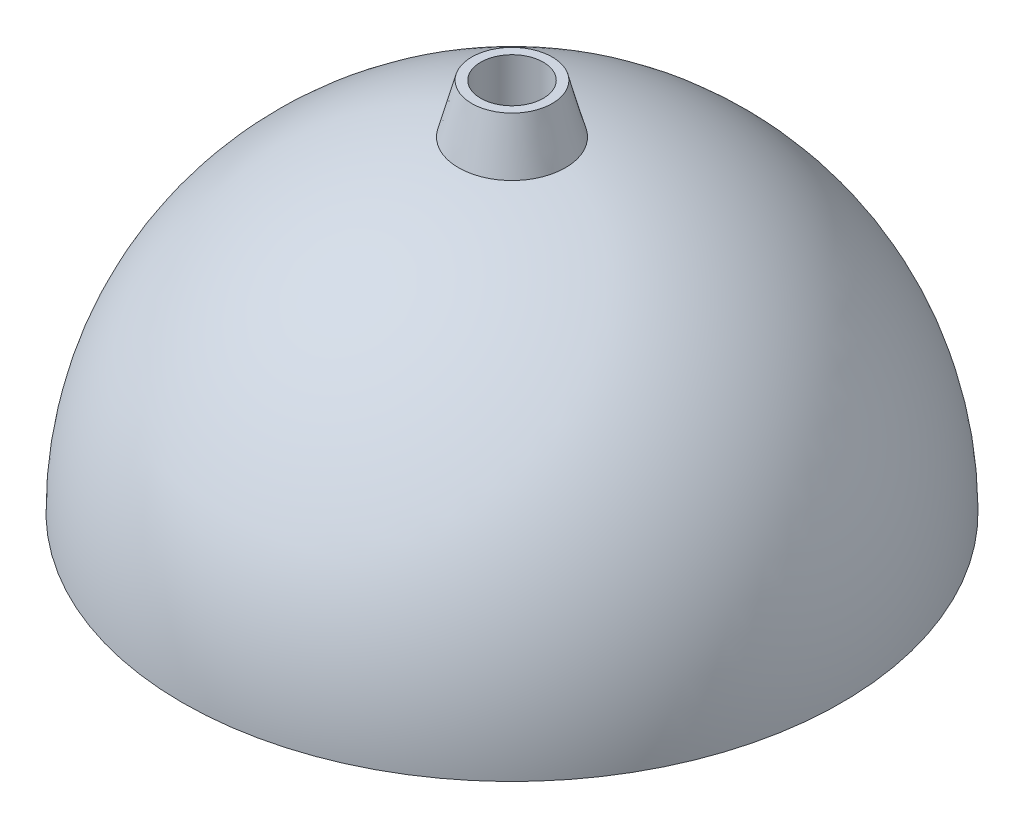
ISO-10303-21;
HEADER;
FILE_DESCRIPTION(('STEP AP214'),'2;1');
FILE_NAME('part.step','',(''),(''),'','','');
FILE_SCHEMA(('AUTOMOTIVE_DESIGN { 1 0 10303 214 1 1 1 1 }'));
ENDSEC;
DATA;
#1=APPLICATION_CONTEXT('core data for automotive mechanical design processes');
#2=APPLICATION_PROTOCOL_DEFINITION('international standard','automotive_design',2000,#1);
#3=PRODUCT_CONTEXT('',#1,'mechanical');
#4=PRODUCT('Part','Part','',(#3));
#5=PRODUCT_RELATED_PRODUCT_CATEGORY('part','',(#4));
#6=PRODUCT_DEFINITION_FORMATION('','',#4);
#7=PRODUCT_DEFINITION_CONTEXT('part definition',#1,'design');
#8=PRODUCT_DEFINITION('design','',#6,#7);
#9=PRODUCT_DEFINITION_SHAPE('','',#8);
#10=(LENGTH_UNIT() NAMED_UNIT(*) SI_UNIT(.MILLI.,.METRE.));
#11=(NAMED_UNIT(*) PLANE_ANGLE_UNIT() SI_UNIT($,.RADIAN.));
#12=(NAMED_UNIT(*) SI_UNIT($,.STERADIAN.) SOLID_ANGLE_UNIT());
#13=UNCERTAINTY_MEASURE_WITH_UNIT(LENGTH_MEASURE(1.E-05),#10,'distance_accuracy_value','');
#14=(GEOMETRIC_REPRESENTATION_CONTEXT(3) GLOBAL_UNCERTAINTY_ASSIGNED_CONTEXT((#13)) GLOBAL_UNIT_ASSIGNED_CONTEXT((#10,
#11,#12)) REPRESENTATION_CONTEXT('',''));
#15=CARTESIAN_POINT('',(0.,0.,0.));
#16=DIRECTION('',(0.,0.,1.));
#17=DIRECTION('',(1.,0.,0.));
#18=AXIS2_PLACEMENT_3D('',#15,#16,#17);
#19=CARTESIAN_POINT('',(0.,0.,0.));
#20=DIRECTION('',(0.,1.,0.));
#21=DIRECTION('',(1.,0.,0.));
#22=AXIS2_PLACEMENT_3D('',#19,#20,#21);
#23=SPHERICAL_SURFACE('',#22,73.66);
#24=CARTESIAN_POINT('',(0.,72.6857558818395,0.));
#25=DIRECTION('',(0.,-1.,0.));
#26=DIRECTION('',(0.,0.,-1.));
#27=AXIS2_PLACEMENT_3D('',#24,#25,#26);
#28=CIRCLE('',#27,11.9405398490031);
#29=CARTESIAN_POINT('',(0.,72.6857558818395,-11.9405398490031));
#30=VERTEX_POINT('',#29);
#31=EDGE_CURVE('E38',#30,#30,#28,.F.);
#32=ORIENTED_EDGE('',*,*,#31,.F.);
#33=EDGE_LOOP('',(#32));
#34=FACE_BOUND('',#33,.T.);
#35=CARTESIAN_POINT('',(0.,0.,0.));
#36=DIRECTION('',(0.,1.,0.));
#37=DIRECTION('',(0.,0.,1.));
#38=AXIS2_PLACEMENT_3D('',#35,#36,#37);
#39=CIRCLE('',#38,73.66);
#40=CARTESIAN_POINT('',(0.,0.,73.66));
#41=VERTEX_POINT('',#40);
#42=EDGE_CURVE('E47',#41,#41,#39,.T.);
#43=ORIENTED_EDGE('',*,*,#42,.T.);
#44=EDGE_LOOP('',(#43));
#45=FACE_BOUND('',#44,.T.);
#46=ADVANCED_FACE('F34',(#34,#45),#23,.T.);
#47=CARTESIAN_POINT('',(0.,0.,0.));
#48=DIRECTION('',(0.,-1.,0.));
#49=DIRECTION('',(-1.,0.,0.));
#50=AXIS2_PLACEMENT_3D('',#47,#48,#49);
#51=SPHERICAL_SURFACE('',#50,70.66);
#52=CARTESIAN_POINT('',(0.,40.636282208791,0.));
#53=DIRECTION('',(0.,-1.,0.));
#54=DIRECTION('',(0.,0.,-1.));
#55=AXIS2_PLACEMENT_3D('',#52,#53,#54);
#56=CIRCLE('',#55,57.805952705993);
#57=CARTESIAN_POINT('',(-57.805952705993,40.636282208791,0.));
#58=VERTEX_POINT('',#57);
#59=EDGE_CURVE('E42',#58,#58,#56,.T.);
#60=CARTESIAN_POINT('',(0.,70.3124142666144,0.));
#61=DIRECTION('',(0.,-1.,0.));
#62=DIRECTION('',(0.,0.,-1.));
#63=AXIS2_PLACEMENT_3D('',#60,#61,#62);
#64=CIRCLE('',#63,7.);
#65=CARTESIAN_POINT('',(-6.99999999999991,70.3124142666144,0.));
#66=VERTEX_POINT('',#65);
#67=EDGE_CURVE('E50',#66,#66,#64,.F.);
#68=CARTESIAN_POINT('',(-57.805952705993,40.636282208791,0.));
#69=CARTESIAN_POINT('',(-57.4424095260213,41.1534337228464,0.));
#70=CARTESIAN_POINT('',(-57.0719229976022,41.6657040947187,0.));
#71=CARTESIAN_POINT('',(-56.3173378326195,42.6801193251516,0.));
#72=CARTESIAN_POINT('',(-55.9332391960559,43.1822641837123,0.));
#73=CARTESIAN_POINT('',(-55.1517044035344,44.1760651585767,0.));
#74=CARTESIAN_POINT('',(-54.7542682475765,44.6677212748805,0.));
#75=CARTESIAN_POINT('',(-53.9463452389753,45.6401910453989,0.));
#76=CARTESIAN_POINT('',(-53.5358583863321,46.1210046996136,0.));
#77=CARTESIAN_POINT('',(-52.7021295033591,47.0714431121582,0.));
#78=CARTESIAN_POINT('',(-52.2788874730292,47.5410678704882,0.));
#79=CARTESIAN_POINT('',(-51.4199531296718,48.4687902569749,0.));
#80=CARTESIAN_POINT('',(-50.9842608166443,48.9268878851316,0.));
#81=CARTESIAN_POINT('',(-50.1007397200991,49.8312260422139,0.));
#82=CARTESIAN_POINT('',(-49.6529109365814,50.2774665711394,0.));
#83=CARTESIAN_POINT('',(-48.7454394665303,51.1577691112724,0.));
#84=CARTESIAN_POINT('',(-48.2857967799968,51.5918311224798,0.));
#85=CARTESIAN_POINT('',(-47.3550285771437,52.4474639780011,0.));
#86=CARTESIAN_POINT('',(-46.8839030608241,52.8690348223149,0.));
#87=CARTESIAN_POINT('',(-45.9305085435173,53.6993816928041,0.));
#88=CARTESIAN_POINT('',(-45.4482395425302,54.1081577189794,0.));
#89=CARTESIAN_POINT('',(-44.4729054272377,54.9126205176759,0.));
#90=CARTESIAN_POINT('',(-43.9798403129324,55.308307290197,0.));
#91=CARTESIAN_POINT('',(-42.9832691187074,56.0863065741216,0.));
#92=CARTESIAN_POINT('',(-42.4797630387877,56.4686190855252,0.));
#93=CARTESIAN_POINT('',(-41.4626725814959,57.2195944730251,0.));
#94=CARTESIAN_POINT('',(-40.9490882041239,57.5882573491213,0.));
#95=CARTESIAN_POINT('',(-39.9122110793468,58.3116679234559,0.));
#96=CARTESIAN_POINT('',(-39.3889183319417,58.6664156216941,0.));
#97=CARTESIAN_POINT('',(-38.3330013873154,59.3617403206629,0.));
#98=CARTESIAN_POINT('',(-37.8003771900942,59.7023173213933,0.));
#99=CARTESIAN_POINT('',(-36.7261809873615,60.3690553126459,0.));
#100=CARTESIAN_POINT('',(-36.18460898185,60.695216303168,0.));
#101=CARTESIAN_POINT('',(-35.0929072490398,61.3328873449475,0.));
#102=CARTESIAN_POINT('',(-34.5427775217411,61.6443973962049,0.));
#103=CARTESIAN_POINT('',(-33.4343565958631,62.2525421832587,0.));
#104=CARTESIAN_POINT('',(-32.8760653972838,62.5491769190551,0.));
#105=CARTESIAN_POINT('',(-31.7517236579413,63.1273574134659,0.));
#106=CARTESIAN_POINT('',(-31.1856731171781,63.4089031720802,0.));
#107=CARTESIAN_POINT('',(-30.0462204115065,63.9567029187787,0.));
#108=CARTESIAN_POINT('',(-29.4728182465983,64.2229569068628,0.));
#109=CARTESIAN_POINT('',(-28.3190753059443,64.7399813335929,0.));
#110=CARTESIAN_POINT('',(-27.7387345301986,64.9907517722387,0.));
#111=CARTESIAN_POINT('',(-26.5715323789592,65.4766284737677,0.));
#112=CARTESIAN_POINT('',(-25.9846710034656,65.7117347366508,0.));
#113=CARTESIAN_POINT('',(-24.8048503605112,66.1661137429863,0.));
#114=CARTESIAN_POINT('',(-24.2118910930504,66.3853864864388,0.));
#115=CARTESIAN_POINT('',(-23.0203017661767,66.8079405149871,0.));
#116=CARTESIAN_POINT('',(-22.4216717067638,67.011221800083,0.));
#117=CARTESIAN_POINT('',(-21.21917198055,67.401646491087,0.));
#118=CARTESIAN_POINT('',(-20.6153023137491,67.5887898969952,0.));
#119=CARTESIAN_POINT('',(-19.4027583314892,67.9468040338761,0.));
#120=CARTESIAN_POINT('',(-18.7940840160302,68.1176747648489,0.));
#121=CARTESIAN_POINT('',(-17.5723691553346,68.4430204725982,0.));
#122=CARTESIAN_POINT('',(-16.959328610098,68.5974954493747,0.));
#123=CARTESIAN_POINT('',(-15.7293228557821,68.8899383958397,0.));
#124=CARTESIAN_POINT('',(-15.1123576467028,69.0279063655282,0.));
#125=CARTESIAN_POINT('',(-13.8749469495953,69.2872358721944,0.));
#126=CARTESIAN_POINT('',(-13.254501461567,69.4085974091722,0.));
#127=CARTESIAN_POINT('',(-12.0105771278078,69.6346268193845,0.));
#128=CARTESIAN_POINT('',(-11.3870982820768,69.7392946926191,0.));
#129=CARTESIAN_POINT('',(-10.1375562287309,69.9318606981428,0.));
#130=CARTESIAN_POINT('',(-9.51149302111604,70.0197588304319,0.));
#131=CARTESIAN_POINT('',(-8.25723351298664,70.1787246041484,0.));
#132=CARTESIAN_POINT('',(-7.62903721247212,70.2497922455758,0.));
#133=CARTESIAN_POINT('',(-6.99999999999991,70.3124142666144,0.));
#134=B_SPLINE_CURVE_WITH_KNOTS('',3,(#68,#69,#70,#71,#72,#73,#74,#75,#76,#77,#78,#79,#80,#81,
#82,#83,#84,#85,#86,#87,#88,#89,#90,#91,#92,#93,#94,#95,#96,#97,#98,#99,#100,#101,#102,#103,
#104,#105,#106,#107,#108,#109,#110,#111,#112,#113,#114,#115,#116,#117,#118,#119,#120,#121,#122,
#123,#124,#125,#126,#127,#128,#129,#130,#131,#132,#133),.UNSPECIFIED.,.F.,.F.,(4,2,2,2,2,2,2,2,
2,2,2,2,2,2,2,2,2,2,2,2,2,2,2,2,2,2,2,2,2,2,2,2,4),(0.,1.89638272983019,3.79276545966037,
5.68914818949055,7.58553091932074,9.48191364915093,11.3782963789811,13.2746791088113,
15.1710618386415,17.0674445684717,18.9638272983018,20.860210028132,22.7565927579622,
24.6529754877924,26.5493582176226,28.4457409474528,30.3421236772829,32.2385064071131,
34.1348891369433,36.0312718667735,37.9276545966037,39.8240373264339,41.720420056264,
43.6168027860942,45.5131855159244,47.4095682457546,49.3059509755848,51.202333705415,
53.0987164352452,54.9950991650753,56.8914818949055,58.7878646247357,60.6842473545659),.UNSPECIFIED.);
#135=EDGE_CURVE('BSEAM79',#58,#66,#134,.T.);
#136=ORIENTED_EDGE('',*,*,#59,.T.);
#137=ORIENTED_EDGE('',*,*,#67,.T.);
#138=ORIENTED_EDGE('',*,*,#135,.T.);
#139=ORIENTED_EDGE('',*,*,#135,.F.);
#140=EDGE_LOOP('',(#136,#138,#137,#139));
#141=FACE_BOUND('',#140,.T.);
#142=ADVANCED_FACE('F79',(#141),#51,.F.);
#143=CARTESIAN_POINT('',(0.,0.,0.));
#144=DIRECTION('',(0.,1.,0.));
#145=DIRECTION('',(0.,0.,1.));
#146=AXIS2_PLACEMENT_3D('',#143,#144,#145);
#147=PLANE('',#146);
#148=CARTESIAN_POINT('',(39.6755045297412,0.,54.6086471203095));
#149=DIRECTION('',(0.,-1.,0.));
#150=DIRECTION('',(-0.587785252292462,0.,-0.809016994374955));
#151=AXIS2_PLACEMENT_3D('',#148,#149,#150);
#152=CIRCLE('',#151,1.75);
#153=CARTESIAN_POINT('',(38.6468803382294,0.,53.1928673801533));
#154=VERTEX_POINT('',#153);
#155=EDGE_CURVE('E200',#154,#154,#152,.T.);
#156=ORIENTED_EDGE('',*,*,#155,.F.);
#157=EDGE_LOOP('',(#156));
#158=FACE_BOUND('',#157,.T.);
#159=CARTESIAN_POINT('',(64.1963148499226,0.,20.8586471203097));
#160=DIRECTION('',(0.,-1.,0.));
#161=DIRECTION('',(-0.95105651629515,0.,-0.309016994374958));
#162=AXIS2_PLACEMENT_3D('',#159,#160,#161);
#163=CIRCLE('',#162,1.75);
#164=CARTESIAN_POINT('',(62.5319659464061,0.,20.3178673801535));
#165=VERTEX_POINT('',#164);
#166=EDGE_CURVE('E208',#165,#165,#163,.T.);
#167=ORIENTED_EDGE('',*,*,#166,.F.);
#168=EDGE_LOOP('',(#167));
#169=FACE_BOUND('',#168,.T.);
#170=CARTESIAN_POINT('',(64.1963148499231,0.,-20.8586471203083));
#171=DIRECTION('',(0.,-1.,0.));
#172=DIRECTION('',(-0.951056516295157,0.,0.309016994374938));
#173=AXIS2_PLACEMENT_3D('',#170,#171,#172);
#174=CIRCLE('',#173,1.75);
#175=CARTESIAN_POINT('',(62.5319659464065,0.,-20.3178673801522));
#176=VERTEX_POINT('',#175);
#177=EDGE_CURVE('E213',#176,#176,#174,.T.);
#178=ORIENTED_EDGE('',*,*,#177,.F.);
#179=EDGE_LOOP('',(#178));
#180=FACE_BOUND('',#179,.T.);
#181=CARTESIAN_POINT('',(39.6755045297424,0.,-54.6086471203086));
#182=DIRECTION('',(0.,-1.,0.));
#183=DIRECTION('',(-0.58778525229248,0.,0.809016994374942));
#184=AXIS2_PLACEMENT_3D('',#181,#182,#183);
#185=CIRCLE('',#184,1.75);
#186=CARTESIAN_POINT('',(38.6468803382306,0.,-53.1928673801525));
#187=VERTEX_POINT('',#186);
#188=EDGE_CURVE('E219',#187,#187,#185,.T.);
#189=ORIENTED_EDGE('',*,*,#188,.F.);
#190=EDGE_LOOP('',(#189));
#191=FACE_BOUND('',#190,.T.);
#192=CARTESIAN_POINT('',(0.,0.,-67.5));
#193=DIRECTION('',(0.,-1.,0.));
#194=DIRECTION('',(0.,0.,1.));
#195=AXIS2_PLACEMENT_3D('',#192,#193,#194);
#196=CIRCLE('',#195,1.75);
#197=CARTESIAN_POINT('',(0.,0.,-65.75));
#198=VERTEX_POINT('',#197);
#199=EDGE_CURVE('E225',#198,#198,#196,.T.);
#200=ORIENTED_EDGE('',*,*,#199,.F.);
#201=EDGE_LOOP('',(#200));
#202=FACE_BOUND('',#201,.T.);
#203=CARTESIAN_POINT('',(-39.6755045297416,0.,-54.6086471203092));
#204=DIRECTION('',(0.,-1.,0.));
#205=DIRECTION('',(0.587785252292469,0.,0.809016994374951));
#206=AXIS2_PLACEMENT_3D('',#203,#204,#205);
#207=CIRCLE('',#206,1.75);
#208=CARTESIAN_POINT('',(-38.6468803382298,0.,-53.192867380153));
#209=VERTEX_POINT('',#208);
#210=EDGE_CURVE('E231',#209,#209,#207,.T.);
#211=ORIENTED_EDGE('',*,*,#210,.F.);
#212=EDGE_LOOP('',(#211));
#213=FACE_BOUND('',#212,.T.);
#214=CARTESIAN_POINT('',(-64.1963148499228,0.,-20.8586471203092));
#215=DIRECTION('',(0.,-1.,0.));
#216=DIRECTION('',(0.951056516295152,0.,0.309016994374952));
#217=AXIS2_PLACEMENT_3D('',#214,#215,#216);
#218=CIRCLE('',#217,1.75);
#219=CARTESIAN_POINT('',(-62.5319659464063,0.,-20.3178673801531));
#220=VERTEX_POINT('',#219);
#221=EDGE_CURVE('E237',#220,#220,#218,.T.);
#222=ORIENTED_EDGE('',*,*,#221,.F.);
#223=EDGE_LOOP('',(#222));
#224=FACE_BOUND('',#223,.T.);
#225=CARTESIAN_POINT('',(-64.1963148499229,0.,20.8586471203088));
#226=DIRECTION('',(0.,-1.,0.));
#227=DIRECTION('',(0.951056516295155,0.,-0.309016994374945));
#228=AXIS2_PLACEMENT_3D('',#225,#226,#227);
#229=CIRCLE('',#228,1.75);
#230=CARTESIAN_POINT('',(-62.5319659464064,0.,20.3178673801526));
#231=VERTEX_POINT('',#230);
#232=EDGE_CURVE('E243',#231,#231,#229,.T.);
#233=ORIENTED_EDGE('',*,*,#232,.F.);
#234=EDGE_LOOP('',(#233));
#235=FACE_BOUND('',#234,.T.);
#236=CARTESIAN_POINT('',(-39.675504529742,0.,54.6086471203089));
#237=DIRECTION('',(0.,-1.,0.));
#238=DIRECTION('',(0.587785252292474,0.,-0.809016994374947));
#239=AXIS2_PLACEMENT_3D('',#236,#237,#238);
#240=CIRCLE('',#239,1.75);
#241=CARTESIAN_POINT('',(-38.6468803382302,0.,53.1928673801528));
#242=VERTEX_POINT('',#241);
#243=EDGE_CURVE('E68',#242,#242,#240,.T.);
#244=ORIENTED_EDGE('',*,*,#243,.F.);
#245=EDGE_LOOP('',(#244));
#246=FACE_BOUND('',#245,.T.);
#247=CARTESIAN_POINT('',(0.,0.,67.5));
#248=DIRECTION('',(0.,-1.,0.));
#249=DIRECTION('',(0.,0.,-1.));
#250=AXIS2_PLACEMENT_3D('',#247,#248,#249);
#251=CIRCLE('',#250,1.75);
#252=CARTESIAN_POINT('',(0.,0.,65.75));
#253=VERTEX_POINT('',#252);
#254=EDGE_CURVE('E60',#253,#253,#251,.T.);
#255=ORIENTED_EDGE('',*,*,#254,.F.);
#256=EDGE_LOOP('',(#255));
#257=FACE_BOUND('',#256,.T.);
#258=CARTESIAN_POINT('',(0.,0.,0.));
#259=DIRECTION('',(0.,-1.,0.));
#260=DIRECTION('',(0.,0.,-1.));
#261=AXIS2_PLACEMENT_3D('',#258,#259,#260);
#262=CIRCLE('',#261,50.8);
#263=CARTESIAN_POINT('',(0.,0.,-50.8));
#264=VERTEX_POINT('',#263);
#265=EDGE_CURVE('E57',#264,#264,#262,.T.);
#266=ORIENTED_EDGE('',*,*,#265,.F.);
#267=EDGE_LOOP('',(#266));
#268=FACE_BOUND('',#267,.T.);
#269=ORIENTED_EDGE('',*,*,#42,.F.);
#270=EDGE_LOOP('',(#269));
#271=FACE_BOUND('',#270,.T.);
#272=ADVANCED_FACE('F76',(#158,#169,#180,#191,#202,#213,#224,#235,#246,#257,#268,#271),#147,.F.);
#273=CARTESIAN_POINT('',(0.,35.,0.));
#274=DIRECTION('',(0.,-1.,0.));
#275=DIRECTION('',(0.,0.,-1.));
#276=AXIS2_PLACEMENT_3D('',#273,#274,#275);
#277=CYLINDRICAL_SURFACE('',#276,50.8);
#278=CARTESIAN_POINT('',(0.,5.,0.));
#279=DIRECTION('',(0.,-1.,0.));
#280=DIRECTION('',(0.,0.,-1.));
#281=AXIS2_PLACEMENT_3D('',#278,#279,#280);
#282=CIRCLE('',#281,50.8);
#283=CARTESIAN_POINT('',(0.,5.,-50.8));
#284=VERTEX_POINT('',#283);
#285=EDGE_CURVE('E52',#284,#284,#282,.T.);
#286=ORIENTED_EDGE('',*,*,#285,.F.);
#287=EDGE_LOOP('',(#286));
#288=FACE_BOUND('',#287,.T.);
#289=ORIENTED_EDGE('',*,*,#265,.T.);
#290=EDGE_LOOP('',(#289));
#291=FACE_BOUND('',#290,.T.);
#292=ADVANCED_FACE('F78',(#288,#291),#277,.F.);
#293=CARTESIAN_POINT('',(0.,5.,0.));
#294=DIRECTION('',(0.,1.,0.));
#295=DIRECTION('',(0.,0.,1.));
#296=AXIS2_PLACEMENT_3D('',#293,#294,#295);
#297=CONICAL_SURFACE('',#296,50.8,0.383972435438754);
#298=CARTESIAN_POINT('',(0.,26.3907435519357,0.));
#299=DIRECTION('',(0.,-1.,0.));
#300=DIRECTION('',(0.,0.,-1.));
#301=AXIS2_PLACEMENT_3D('',#298,#299,#300);
#302=CIRCLE('',#301,59.4424213850963);
#303=CARTESIAN_POINT('',(0.,26.3907435519357,-59.4424213850963));
#304=VERTEX_POINT('',#303);
#305=EDGE_CURVE('E10',#304,#304,#302,.F.);
#306=ORIENTED_EDGE('',*,*,#305,.T.);
#307=EDGE_LOOP('',(#306));
#308=FACE_BOUND('',#307,.T.);
#309=ORIENTED_EDGE('',*,*,#285,.T.);
#310=EDGE_LOOP('',(#309));
#311=FACE_BOUND('',#310,.T.);
#312=ADVANCED_FACE('F86',(#308,#311),#297,.F.);
#313=CARTESIAN_POINT('',(0.,32.0098424531744,0.));
#314=DIRECTION('',(0.,-1.,0.));
#315=DIRECTION('',(0.,0.,-1.));
#316=AXIS2_PLACEMENT_3D('',#313,#314,#315);
#317=TOROIDAL_SURFACE('',#316,45.5346635665945,15.);
#318=ORIENTED_EDGE('',*,*,#305,.F.);
#319=EDGE_LOOP('',(#318));
#320=FACE_BOUND('',#319,.T.);
#321=ORIENTED_EDGE('',*,*,#59,.F.);
#322=EDGE_LOOP('',(#321));
#323=FACE_BOUND('',#322,.T.);
#324=ADVANCED_FACE('F102',(#320,#323),#317,.F.);
#325=CARTESIAN_POINT('',(0.,73.66,0.));
#326=DIRECTION('',(0.,-1.,0.));
#327=DIRECTION('',(0.,0.,-1.));
#328=AXIS2_PLACEMENT_3D('',#325,#326,#327);
#329=CYLINDRICAL_SURFACE('',#328,7.);
#330=ORIENTED_EDGE('',*,*,#67,.F.);
#331=EDGE_LOOP('',(#330));
#332=FACE_BOUND('',#331,.T.);
#333=CARTESIAN_POINT('',(0.,83.66,0.));
#334=DIRECTION('',(0.,1.,0.));
#335=DIRECTION('',(0.,0.,1.));
#336=AXIS2_PLACEMENT_3D('',#333,#334,#335);
#337=CIRCLE('',#336,7.);
#338=CARTESIAN_POINT('',(0.,83.66,7.));
#339=VERTEX_POINT('',#338);
#340=EDGE_CURVE('E196',#339,#339,#337,.T.);
#341=ORIENTED_EDGE('',*,*,#340,.T.);
#342=EDGE_LOOP('',(#341));
#343=FACE_BOUND('',#342,.T.);
#344=ADVANCED_FACE('F103',(#332,#343),#329,.F.);
#345=CARTESIAN_POINT('',(0.,10.,67.5));
#346=DIRECTION('',(0.,-1.,0.));
#347=DIRECTION('',(0.,0.,-1.));
#348=AXIS2_PLACEMENT_3D('',#345,#346,#347);
#349=CYLINDRICAL_SURFACE('',#348,1.75);
#350=CARTESIAN_POINT('',(0.,10.,67.5));
#351=DIRECTION('',(0.,-1.,0.));
#352=DIRECTION('',(0.,0.,-1.));
#353=AXIS2_PLACEMENT_3D('',#350,#351,#352);
#354=CIRCLE('',#353,1.75);
#355=CARTESIAN_POINT('',(0.,10.,65.75));
#356=VERTEX_POINT('',#355);
#357=EDGE_CURVE('E53',#356,#356,#354,.T.);
#358=ORIENTED_EDGE('',*,*,#357,.F.);
#359=EDGE_LOOP('',(#358));
#360=FACE_BOUND('',#359,.T.);
#361=ORIENTED_EDGE('',*,*,#254,.T.);
#362=EDGE_LOOP('',(#361));
#363=FACE_BOUND('',#362,.T.);
#364=ADVANCED_FACE('F106',(#360,#363),#349,.F.);
#365=CARTESIAN_POINT('',(0.,10.,67.5));
#366=DIRECTION('',(0.,-1.,0.));
#367=DIRECTION('',(0.,0.,-1.));
#368=AXIS2_PLACEMENT_3D('',#365,#366,#367);
#369=PLANE('',#368);
#370=ORIENTED_EDGE('',*,*,#357,.T.);
#371=EDGE_LOOP('',(#370));
#372=FACE_BOUND('',#371,.T.);
#373=ADVANCED_FACE('F110',(#372),#369,.T.);
#374=CARTESIAN_POINT('',(-39.675504529742,10.,54.6086471203089));
#375=DIRECTION('',(0.,-1.,0.));
#376=DIRECTION('',(0.,0.,-1.));
#377=AXIS2_PLACEMENT_3D('',#374,#375,#376);
#378=CYLINDRICAL_SURFACE('',#377,1.75);
#379=CARTESIAN_POINT('',(-39.675504529742,10.,54.6086471203089));
#380=DIRECTION('',(0.,-1.,0.));
#381=DIRECTION('',(0.587785252292474,0.,-0.809016994374947));
#382=AXIS2_PLACEMENT_3D('',#379,#380,#381);
#383=CIRCLE('',#382,1.75);
#384=CARTESIAN_POINT('',(-38.6468803382302,10.,53.1928673801528));
#385=VERTEX_POINT('',#384);
#386=EDGE_CURVE('E65',#385,#385,#383,.T.);
#387=ORIENTED_EDGE('',*,*,#386,.F.);
#388=EDGE_LOOP('',(#387));
#389=FACE_BOUND('',#388,.T.);
#390=ORIENTED_EDGE('',*,*,#243,.T.);
#391=EDGE_LOOP('',(#390));
#392=FACE_BOUND('',#391,.T.);
#393=ADVANCED_FACE('F114',(#389,#392),#378,.F.);
#394=CARTESIAN_POINT('',(-39.675504529742,10.,54.6086471203089));
#395=DIRECTION('',(0.,-1.,0.));
#396=DIRECTION('',(0.587785252292474,0.,-0.809016994374947));
#397=AXIS2_PLACEMENT_3D('',#394,#395,#396);
#398=PLANE('',#397);
#399=ORIENTED_EDGE('',*,*,#386,.T.);
#400=EDGE_LOOP('',(#399));
#401=FACE_BOUND('',#400,.T.);
#402=ADVANCED_FACE('F117',(#401),#398,.T.);
#403=CARTESIAN_POINT('',(-64.1963148499229,10.,20.8586471203088));
#404=DIRECTION('',(0.,-1.,0.));
#405=DIRECTION('',(0.,0.,-1.));
#406=AXIS2_PLACEMENT_3D('',#403,#404,#405);
#407=CYLINDRICAL_SURFACE('',#406,1.75);
#408=CARTESIAN_POINT('',(-64.1963148499229,10.,20.8586471203088));
#409=DIRECTION('',(0.,-1.,0.));
#410=DIRECTION('',(0.951056516295155,0.,-0.309016994374945));
#411=AXIS2_PLACEMENT_3D('',#408,#409,#410);
#412=CIRCLE('',#411,1.75);
#413=CARTESIAN_POINT('',(-62.5319659464064,10.,20.3178673801526));
#414=VERTEX_POINT('',#413);
#415=EDGE_CURVE('E246',#414,#414,#412,.T.);
#416=ORIENTED_EDGE('',*,*,#415,.F.);
#417=EDGE_LOOP('',(#416));
#418=FACE_BOUND('',#417,.T.);
#419=ORIENTED_EDGE('',*,*,#232,.T.);
#420=EDGE_LOOP('',(#419));
#421=FACE_BOUND('',#420,.T.);
#422=ADVANCED_FACE('F121',(#418,#421),#407,.F.);
#423=CARTESIAN_POINT('',(-64.1963148499229,10.,20.8586471203088));
#424=DIRECTION('',(0.,-1.,0.));
#425=DIRECTION('',(0.951056516295155,0.,-0.309016994374945));
#426=AXIS2_PLACEMENT_3D('',#423,#424,#425);
#427=PLANE('',#426);
#428=ORIENTED_EDGE('',*,*,#415,.T.);
#429=EDGE_LOOP('',(#428));
#430=FACE_BOUND('',#429,.T.);
#431=ADVANCED_FACE('F125',(#430),#427,.T.);
#432=CARTESIAN_POINT('',(-64.1963148499228,10.,-20.8586471203092));
#433=DIRECTION('',(0.,-1.,0.));
#434=DIRECTION('',(0.,0.,-1.));
#435=AXIS2_PLACEMENT_3D('',#432,#433,#434);
#436=CYLINDRICAL_SURFACE('',#435,1.75);
#437=CARTESIAN_POINT('',(-64.1963148499228,10.,-20.8586471203092));
#438=DIRECTION('',(0.,-1.,0.));
#439=DIRECTION('',(0.951056516295152,0.,0.309016994374952));
#440=AXIS2_PLACEMENT_3D('',#437,#438,#439);
#441=CIRCLE('',#440,1.75);
#442=CARTESIAN_POINT('',(-62.5319659464063,10.,-20.3178673801531));
#443=VERTEX_POINT('',#442);
#444=EDGE_CURVE('E240',#443,#443,#441,.T.);
#445=ORIENTED_EDGE('',*,*,#444,.F.);
#446=EDGE_LOOP('',(#445));
#447=FACE_BOUND('',#446,.T.);
#448=ORIENTED_EDGE('',*,*,#221,.T.);
#449=EDGE_LOOP('',(#448));
#450=FACE_BOUND('',#449,.T.);
#451=ADVANCED_FACE('F129',(#447,#450),#436,.F.);
#452=CARTESIAN_POINT('',(-64.1963148499228,10.,-20.8586471203092));
#453=DIRECTION('',(0.,-1.,0.));
#454=DIRECTION('',(0.951056516295152,0.,0.309016994374952));
#455=AXIS2_PLACEMENT_3D('',#452,#453,#454);
#456=PLANE('',#455);
#457=ORIENTED_EDGE('',*,*,#444,.T.);
#458=EDGE_LOOP('',(#457));
#459=FACE_BOUND('',#458,.T.);
#460=ADVANCED_FACE('F133',(#459),#456,.T.);
#461=CARTESIAN_POINT('',(-39.6755045297416,10.,-54.6086471203092));
#462=DIRECTION('',(0.,-1.,0.));
#463=DIRECTION('',(0.,0.,-1.));
#464=AXIS2_PLACEMENT_3D('',#461,#462,#463);
#465=CYLINDRICAL_SURFACE('',#464,1.75);
#466=CARTESIAN_POINT('',(-39.6755045297416,10.,-54.6086471203092));
#467=DIRECTION('',(0.,-1.,0.));
#468=DIRECTION('',(0.587785252292469,0.,0.809016994374951));
#469=AXIS2_PLACEMENT_3D('',#466,#467,#468);
#470=CIRCLE('',#469,1.75);
#471=CARTESIAN_POINT('',(-38.6468803382298,10.,-53.192867380153));
#472=VERTEX_POINT('',#471);
#473=EDGE_CURVE('E234',#472,#472,#470,.T.);
#474=ORIENTED_EDGE('',*,*,#473,.F.);
#475=EDGE_LOOP('',(#474));
#476=FACE_BOUND('',#475,.T.);
#477=ORIENTED_EDGE('',*,*,#210,.T.);
#478=EDGE_LOOP('',(#477));
#479=FACE_BOUND('',#478,.T.);
#480=ADVANCED_FACE('F137',(#476,#479),#465,.F.);
#481=CARTESIAN_POINT('',(-39.6755045297416,10.,-54.6086471203092));
#482=DIRECTION('',(0.,-1.,0.));
#483=DIRECTION('',(0.587785252292469,0.,0.809016994374951));
#484=AXIS2_PLACEMENT_3D('',#481,#482,#483);
#485=PLANE('',#484);
#486=ORIENTED_EDGE('',*,*,#473,.T.);
#487=EDGE_LOOP('',(#486));
#488=FACE_BOUND('',#487,.T.);
#489=ADVANCED_FACE('F141',(#488),#485,.T.);
#490=CARTESIAN_POINT('',(0.,10.,-67.5));
#491=DIRECTION('',(0.,-1.,0.));
#492=DIRECTION('',(0.,0.,-1.));
#493=AXIS2_PLACEMENT_3D('',#490,#491,#492);
#494=CYLINDRICAL_SURFACE('',#493,1.75);
#495=CARTESIAN_POINT('',(0.,10.,-67.5));
#496=DIRECTION('',(0.,-1.,0.));
#497=DIRECTION('',(0.,0.,1.));
#498=AXIS2_PLACEMENT_3D('',#495,#496,#497);
#499=CIRCLE('',#498,1.75);
#500=CARTESIAN_POINT('',(0.,10.,-65.75));
#501=VERTEX_POINT('',#500);
#502=EDGE_CURVE('E228',#501,#501,#499,.T.);
#503=ORIENTED_EDGE('',*,*,#502,.F.);
#504=EDGE_LOOP('',(#503));
#505=FACE_BOUND('',#504,.T.);
#506=ORIENTED_EDGE('',*,*,#199,.T.);
#507=EDGE_LOOP('',(#506));
#508=FACE_BOUND('',#507,.T.);
#509=ADVANCED_FACE('F145',(#505,#508),#494,.F.);
#510=CARTESIAN_POINT('',(0.,10.,-67.5));
#511=DIRECTION('',(0.,-1.,0.));
#512=DIRECTION('',(0.,0.,1.));
#513=AXIS2_PLACEMENT_3D('',#510,#511,#512);
#514=PLANE('',#513);
#515=ORIENTED_EDGE('',*,*,#502,.T.);
#516=EDGE_LOOP('',(#515));
#517=FACE_BOUND('',#516,.T.);
#518=ADVANCED_FACE('F149',(#517),#514,.T.);
#519=CARTESIAN_POINT('',(39.6755045297424,10.,-54.6086471203086));
#520=DIRECTION('',(0.,-1.,0.));
#521=DIRECTION('',(0.,0.,-1.));
#522=AXIS2_PLACEMENT_3D('',#519,#520,#521);
#523=CYLINDRICAL_SURFACE('',#522,1.75);
#524=CARTESIAN_POINT('',(39.6755045297424,10.,-54.6086471203086));
#525=DIRECTION('',(0.,-1.,0.));
#526=DIRECTION('',(-0.58778525229248,0.,0.809016994374942));
#527=AXIS2_PLACEMENT_3D('',#524,#525,#526);
#528=CIRCLE('',#527,1.75);
#529=CARTESIAN_POINT('',(38.6468803382306,10.,-53.1928673801525));
#530=VERTEX_POINT('',#529);
#531=EDGE_CURVE('E222',#530,#530,#528,.T.);
#532=ORIENTED_EDGE('',*,*,#531,.F.);
#533=EDGE_LOOP('',(#532));
#534=FACE_BOUND('',#533,.T.);
#535=ORIENTED_EDGE('',*,*,#188,.T.);
#536=EDGE_LOOP('',(#535));
#537=FACE_BOUND('',#536,.T.);
#538=ADVANCED_FACE('F153',(#534,#537),#523,.F.);
#539=CARTESIAN_POINT('',(39.6755045297424,10.,-54.6086471203086));
#540=DIRECTION('',(0.,-1.,0.));
#541=DIRECTION('',(-0.58778525229248,0.,0.809016994374942));
#542=AXIS2_PLACEMENT_3D('',#539,#540,#541);
#543=PLANE('',#542);
#544=ORIENTED_EDGE('',*,*,#531,.T.);
#545=EDGE_LOOP('',(#544));
#546=FACE_BOUND('',#545,.T.);
#547=ADVANCED_FACE('F157',(#546),#543,.T.);
#548=CARTESIAN_POINT('',(64.1963148499231,10.,-20.8586471203083));
#549=DIRECTION('',(0.,-1.,0.));
#550=DIRECTION('',(0.,0.,-1.));
#551=AXIS2_PLACEMENT_3D('',#548,#549,#550);
#552=CYLINDRICAL_SURFACE('',#551,1.75);
#553=CARTESIAN_POINT('',(64.1963148499231,10.,-20.8586471203083));
#554=DIRECTION('',(0.,-1.,0.));
#555=DIRECTION('',(-0.951056516295157,0.,0.309016994374938));
#556=AXIS2_PLACEMENT_3D('',#553,#554,#555);
#557=CIRCLE('',#556,1.75);
#558=CARTESIAN_POINT('',(62.5319659464065,10.,-20.3178673801522));
#559=VERTEX_POINT('',#558);
#560=EDGE_CURVE('E216',#559,#559,#557,.T.);
#561=ORIENTED_EDGE('',*,*,#560,.F.);
#562=EDGE_LOOP('',(#561));
#563=FACE_BOUND('',#562,.T.);
#564=ORIENTED_EDGE('',*,*,#177,.T.);
#565=EDGE_LOOP('',(#564));
#566=FACE_BOUND('',#565,.T.);
#567=ADVANCED_FACE('F161',(#563,#566),#552,.F.);
#568=CARTESIAN_POINT('',(64.1963148499231,10.,-20.8586471203083));
#569=DIRECTION('',(0.,-1.,0.));
#570=DIRECTION('',(-0.951056516295157,0.,0.309016994374938));
#571=AXIS2_PLACEMENT_3D('',#568,#569,#570);
#572=PLANE('',#571);
#573=ORIENTED_EDGE('',*,*,#560,.T.);
#574=EDGE_LOOP('',(#573));
#575=FACE_BOUND('',#574,.T.);
#576=ADVANCED_FACE('F165',(#575),#572,.T.);
#577=CARTESIAN_POINT('',(64.1963148499226,10.,20.8586471203097));
#578=DIRECTION('',(0.,-1.,0.));
#579=DIRECTION('',(0.,0.,-1.));
#580=AXIS2_PLACEMENT_3D('',#577,#578,#579);
#581=CYLINDRICAL_SURFACE('',#580,1.75);
#582=CARTESIAN_POINT('',(64.1963148499226,10.,20.8586471203097));
#583=DIRECTION('',(0.,-1.,0.));
#584=DIRECTION('',(-0.95105651629515,0.,-0.309016994374958));
#585=AXIS2_PLACEMENT_3D('',#582,#583,#584);
#586=CIRCLE('',#585,1.75);
#587=CARTESIAN_POINT('',(62.5319659464061,10.,20.3178673801535));
#588=VERTEX_POINT('',#587);
#589=EDGE_CURVE('E210',#588,#588,#586,.T.);
#590=ORIENTED_EDGE('',*,*,#589,.F.);
#591=EDGE_LOOP('',(#590));
#592=FACE_BOUND('',#591,.T.);
#593=ORIENTED_EDGE('',*,*,#166,.T.);
#594=EDGE_LOOP('',(#593));
#595=FACE_BOUND('',#594,.T.);
#596=ADVANCED_FACE('F169',(#592,#595),#581,.F.);
#597=CARTESIAN_POINT('',(64.1963148499226,10.,20.8586471203097));
#598=DIRECTION('',(0.,-1.,0.));
#599=DIRECTION('',(-0.95105651629515,0.,-0.309016994374958));
#600=AXIS2_PLACEMENT_3D('',#597,#598,#599);
#601=PLANE('',#600);
#602=ORIENTED_EDGE('',*,*,#589,.T.);
#603=EDGE_LOOP('',(#602));
#604=FACE_BOUND('',#603,.T.);
#605=ADVANCED_FACE('F173',(#604),#601,.T.);
#606=CARTESIAN_POINT('',(39.6755045297412,10.,54.6086471203095));
#607=DIRECTION('',(0.,-1.,0.));
#608=DIRECTION('',(0.,0.,-1.));
#609=AXIS2_PLACEMENT_3D('',#606,#607,#608);
#610=CYLINDRICAL_SURFACE('',#609,1.75);
#611=CARTESIAN_POINT('',(39.6755045297412,10.,54.6086471203095));
#612=DIRECTION('',(0.,-1.,0.));
#613=DIRECTION('',(-0.587785252292462,0.,-0.809016994374955));
#614=AXIS2_PLACEMENT_3D('',#611,#612,#613);
#615=CIRCLE('',#614,1.75);
#616=CARTESIAN_POINT('',(38.6468803382294,10.,53.1928673801533));
#617=VERTEX_POINT('',#616);
#618=EDGE_CURVE('E203',#617,#617,#615,.T.);
#619=ORIENTED_EDGE('',*,*,#618,.F.);
#620=EDGE_LOOP('',(#619));
#621=FACE_BOUND('',#620,.T.);
#622=ORIENTED_EDGE('',*,*,#155,.T.);
#623=EDGE_LOOP('',(#622));
#624=FACE_BOUND('',#623,.T.);
#625=ADVANCED_FACE('F177',(#621,#624),#610,.F.);
#626=CARTESIAN_POINT('',(39.6755045297412,10.,54.6086471203095));
#627=DIRECTION('',(0.,-1.,0.));
#628=DIRECTION('',(-0.587785252292462,0.,-0.809016994374955));
#629=AXIS2_PLACEMENT_3D('',#626,#627,#628);
#630=PLANE('',#629);
#631=ORIENTED_EDGE('',*,*,#618,.T.);
#632=EDGE_LOOP('',(#631));
#633=FACE_BOUND('',#632,.T.);
#634=ADVANCED_FACE('F181',(#633),#630,.T.);
#635=CARTESIAN_POINT('',(0.,83.66,0.));
#636=DIRECTION('',(0.,-1.,0.));
#637=DIRECTION('',(0.,0.,1.));
#638=AXIS2_PLACEMENT_3D('',#635,#636,#637);
#639=CONICAL_SURFACE('',#638,9.,0.26179938779915);
#640=CARTESIAN_POINT('',(0.,83.66,0.));
#641=DIRECTION('',(0.,1.,0.));
#642=DIRECTION('',(0.,0.,1.));
#643=AXIS2_PLACEMENT_3D('',#640,#641,#642);
#644=CIRCLE('',#643,9.);
#645=CARTESIAN_POINT('',(0.,83.66,9.));
#646=VERTEX_POINT('',#645);
#647=EDGE_CURVE('E199',#646,#646,#644,.T.);
#648=ORIENTED_EDGE('',*,*,#647,.F.);
#649=EDGE_LOOP('',(#648));
#650=FACE_BOUND('',#649,.T.);
#651=ORIENTED_EDGE('',*,*,#31,.T.);
#652=EDGE_LOOP('',(#651));
#653=FACE_BOUND('',#652,.T.);
#654=ADVANCED_FACE('F36',(#650,#653),#639,.T.);
#655=CARTESIAN_POINT('',(0.,83.66,0.));
#656=DIRECTION('',(0.,1.,0.));
#657=DIRECTION('',(0.,0.,1.));
#658=AXIS2_PLACEMENT_3D('',#655,#656,#657);
#659=PLANE('',#658);
#660=ORIENTED_EDGE('',*,*,#340,.F.);
#661=EDGE_LOOP('',(#660));
#662=FACE_BOUND('',#661,.T.);
#663=ORIENTED_EDGE('',*,*,#647,.T.);
#664=EDGE_LOOP('',(#663));
#665=FACE_BOUND('',#664,.T.);
#666=ADVANCED_FACE('F186',(#662,#665),#659,.T.);
#667=CLOSED_SHELL('',(#46,#142,#272,#292,#312,#324,#344,#364,#373,#393,#402,#422,#431,#451,#460,
#480,#489,#509,#518,#538,#547,#567,#576,#596,#605,#625,#634,#654,#666));
#668=MANIFOLD_SOLID_BREP('B2',#667);
#669=ADVANCED_BREP_SHAPE_REPRESENTATION('',(#18,#668),#14);
#670=SHAPE_DEFINITION_REPRESENTATION(#9,#669);
ENDSEC;
END-ISO-10303-21;
